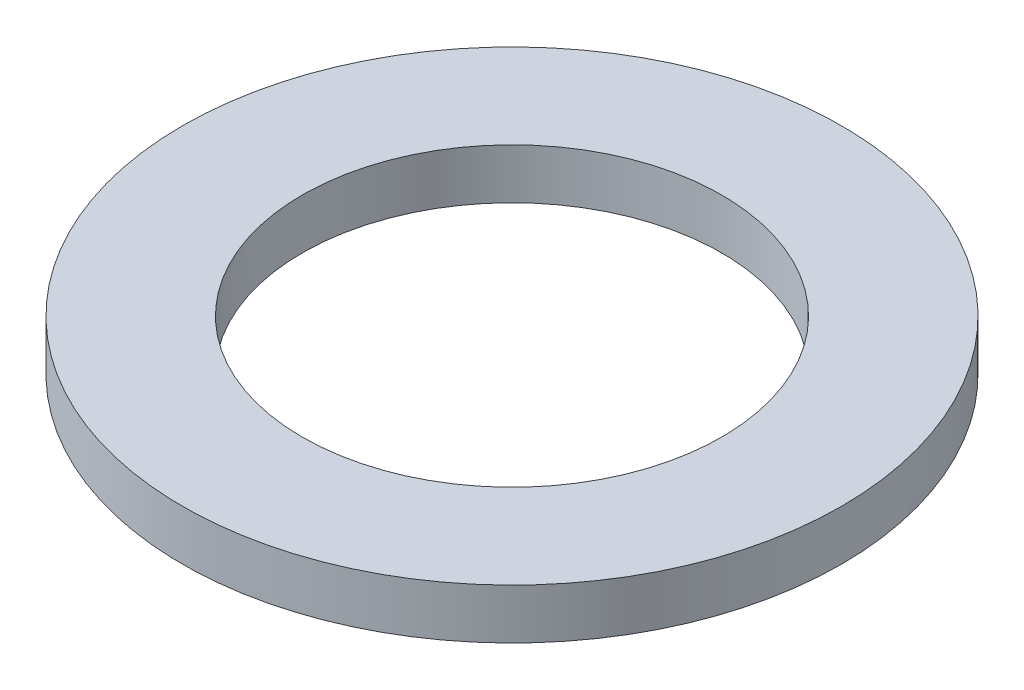
ISO-10303-21;
HEADER;
FILE_DESCRIPTION(('STEP AP214'),'2;1');
FILE_NAME('part.step','',(''),(''),'','','');
FILE_SCHEMA(('AUTOMOTIVE_DESIGN { 1 0 10303 214 1 1 1 1 }'));
ENDSEC;
DATA;
#1=APPLICATION_CONTEXT('core data for automotive mechanical design processes');
#2=APPLICATION_PROTOCOL_DEFINITION('international standard','automotive_design',2000,#1);
#3=PRODUCT_CONTEXT('',#1,'mechanical');
#4=PRODUCT('Part','Part','',(#3));
#5=PRODUCT_RELATED_PRODUCT_CATEGORY('part','',(#4));
#6=PRODUCT_DEFINITION_FORMATION('','',#4);
#7=PRODUCT_DEFINITION_CONTEXT('part definition',#1,'design');
#8=PRODUCT_DEFINITION('design','',#6,#7);
#9=PRODUCT_DEFINITION_SHAPE('','',#8);
#10=(LENGTH_UNIT() NAMED_UNIT(*) SI_UNIT(.MILLI.,.METRE.));
#11=(NAMED_UNIT(*) PLANE_ANGLE_UNIT() SI_UNIT($,.RADIAN.));
#12=(NAMED_UNIT(*) SI_UNIT($,.STERADIAN.) SOLID_ANGLE_UNIT());
#13=UNCERTAINTY_MEASURE_WITH_UNIT(LENGTH_MEASURE(1.E-05),#10,'distance_accuracy_value','');
#14=(GEOMETRIC_REPRESENTATION_CONTEXT(3) GLOBAL_UNCERTAINTY_ASSIGNED_CONTEXT((#13)) GLOBAL_UNIT_ASSIGNED_CONTEXT((#10,
#11,#12)) REPRESENTATION_CONTEXT('',''));
#15=CARTESIAN_POINT('',(0.,0.,0.));
#16=DIRECTION('',(0.,0.,1.));
#17=DIRECTION('',(1.,0.,0.));
#18=AXIS2_PLACEMENT_3D('',#15,#16,#17);
#19=CARTESIAN_POINT('',(0.,3.35,0.));
#20=DIRECTION('',(0.,1.,0.));
#21=DIRECTION('',(0.,0.,1.));
#22=AXIS2_PLACEMENT_3D('',#19,#20,#21);
#23=PLANE('',#22);
#24=CARTESIAN_POINT('',(0.,3.35,0.));
#25=DIRECTION('',(0.,1.,0.));
#26=DIRECTION('',(1.,0.,0.));
#27=AXIS2_PLACEMENT_3D('',#24,#25,#26);
#28=CIRCLE('',#27,22.);
#29=CARTESIAN_POINT('',(22.,3.35,0.));
#30=VERTEX_POINT('',#29);
#31=EDGE_CURVE('E11',#30,#30,#28,.T.);
#32=ORIENTED_EDGE('',*,*,#31,.T.);
#33=EDGE_LOOP('',(#32));
#34=FACE_BOUND('',#33,.T.);
#35=CARTESIAN_POINT('',(0.,3.35,0.));
#36=DIRECTION('',(0.,1.,0.));
#37=DIRECTION('',(0.,0.,1.));
#38=AXIS2_PLACEMENT_3D('',#35,#36,#37);
#39=CIRCLE('',#38,14.);
#40=CARTESIAN_POINT('',(0.,3.35,14.));
#41=VERTEX_POINT('',#40);
#42=EDGE_CURVE('E56',#41,#41,#39,.T.);
#43=ORIENTED_EDGE('',*,*,#42,.F.);
#44=EDGE_LOOP('',(#43));
#45=FACE_BOUND('',#44,.T.);
#46=ADVANCED_FACE('F43',(#34,#45),#23,.T.);
#47=CARTESIAN_POINT('',(0.,0.,0.));
#48=DIRECTION('',(0.,1.,0.));
#49=DIRECTION('',(0.,0.,1.));
#50=AXIS2_PLACEMENT_3D('',#47,#48,#49);
#51=PLANE('',#50);
#52=CARTESIAN_POINT('',(0.,0.,0.));
#53=DIRECTION('',(0.,1.,0.));
#54=DIRECTION('',(1.,0.,0.));
#55=AXIS2_PLACEMENT_3D('',#52,#53,#54);
#56=CIRCLE('',#55,22.);
#57=CARTESIAN_POINT('',(22.,0.,0.));
#58=VERTEX_POINT('',#57);
#59=EDGE_CURVE('E47',#58,#58,#56,.T.);
#60=ORIENTED_EDGE('',*,*,#59,.F.);
#61=EDGE_LOOP('',(#60));
#62=FACE_BOUND('',#61,.T.);
#63=CARTESIAN_POINT('',(0.,0.,0.));
#64=DIRECTION('',(0.,1.,0.));
#65=DIRECTION('',(0.,0.,1.));
#66=AXIS2_PLACEMENT_3D('',#63,#64,#65);
#67=CIRCLE('',#66,14.);
#68=CARTESIAN_POINT('',(0.,0.,14.));
#69=VERTEX_POINT('',#68);
#70=EDGE_CURVE('E58',#69,#69,#67,.T.);
#71=ORIENTED_EDGE('',*,*,#70,.T.);
#72=EDGE_LOOP('',(#71));
#73=FACE_BOUND('',#72,.T.);
#74=ADVANCED_FACE('F70',(#62,#73),#51,.F.);
#75=CARTESIAN_POINT('',(0.,3.35,0.));
#76=DIRECTION('',(0.,-1.,0.));
#77=DIRECTION('',(0.,0.,-1.));
#78=AXIS2_PLACEMENT_3D('',#75,#76,#77);
#79=CYLINDRICAL_SURFACE('',#78,22.);
#80=ORIENTED_EDGE('',*,*,#31,.F.);
#81=EDGE_LOOP('',(#80));
#82=FACE_BOUND('',#81,.T.);
#83=ORIENTED_EDGE('',*,*,#59,.T.);
#84=EDGE_LOOP('',(#83));
#85=FACE_BOUND('',#84,.T.);
#86=ADVANCED_FACE('F45',(#82,#85),#79,.T.);
#87=CARTESIAN_POINT('',(0.,3.35,0.));
#88=DIRECTION('',(0.,-1.,0.));
#89=DIRECTION('',(0.,0.,-1.));
#90=AXIS2_PLACEMENT_3D('',#87,#88,#89);
#91=CYLINDRICAL_SURFACE('',#90,14.);
#92=ORIENTED_EDGE('',*,*,#42,.T.);
#93=EDGE_LOOP('',(#92));
#94=FACE_BOUND('',#93,.T.);
#95=ORIENTED_EDGE('',*,*,#70,.F.);
#96=EDGE_LOOP('',(#95));
#97=FACE_BOUND('',#96,.T.);
#98=ADVANCED_FACE('F66',(#94,#97),#91,.F.);
#99=CLOSED_SHELL('',(#46,#74,#86,#98));
#100=MANIFOLD_SOLID_BREP('B2',#99);
#101=ADVANCED_BREP_SHAPE_REPRESENTATION('',(#18,#100),#14);
#102=SHAPE_DEFINITION_REPRESENTATION(#9,#101);
ENDSEC;
END-ISO-10303-21;
